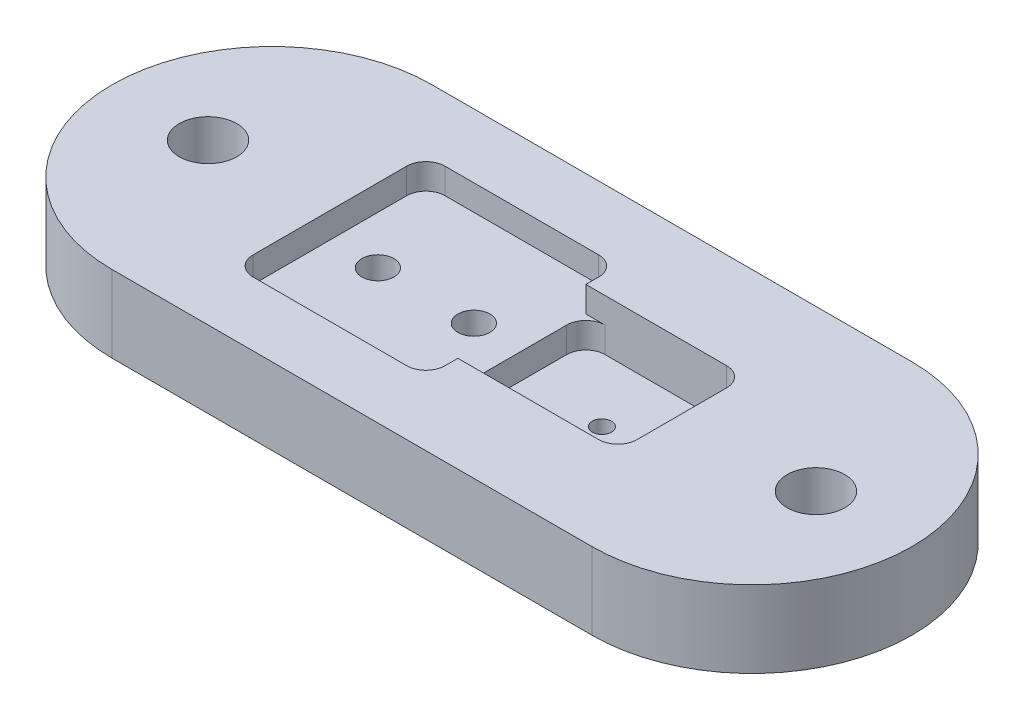
ISO-10303-21;
HEADER;
FILE_DESCRIPTION(('STEP AP214'),'2;1');
FILE_NAME('part.step','',(''),(''),'','','');
FILE_SCHEMA(('AUTOMOTIVE_DESIGN { 1 0 10303 214 1 1 1 1 }'));
ENDSEC;
DATA;
#1=APPLICATION_CONTEXT('core data for automotive mechanical design processes');
#2=APPLICATION_PROTOCOL_DEFINITION('international standard','automotive_design',2000,#1);
#3=PRODUCT_CONTEXT('',#1,'mechanical');
#4=PRODUCT('Part','Part','',(#3));
#5=PRODUCT_RELATED_PRODUCT_CATEGORY('part','',(#4));
#6=PRODUCT_DEFINITION_FORMATION('','',#4);
#7=PRODUCT_DEFINITION_CONTEXT('part definition',#1,'design');
#8=PRODUCT_DEFINITION('design','',#6,#7);
#9=PRODUCT_DEFINITION_SHAPE('','',#8);
#10=(LENGTH_UNIT() NAMED_UNIT(*) SI_UNIT(.MILLI.,.METRE.));
#11=(NAMED_UNIT(*) PLANE_ANGLE_UNIT() SI_UNIT($,.RADIAN.));
#12=(NAMED_UNIT(*) SI_UNIT($,.STERADIAN.) SOLID_ANGLE_UNIT());
#13=UNCERTAINTY_MEASURE_WITH_UNIT(LENGTH_MEASURE(1.E-05),#10,'distance_accuracy_value','');
#14=(GEOMETRIC_REPRESENTATION_CONTEXT(3) GLOBAL_UNCERTAINTY_ASSIGNED_CONTEXT((#13)) GLOBAL_UNIT_ASSIGNED_CONTEXT((#10,
#11,#12)) REPRESENTATION_CONTEXT('',''));
#15=CARTESIAN_POINT('',(0.,0.,0.));
#16=DIRECTION('',(0.,0.,1.));
#17=DIRECTION('',(1.,0.,0.));
#18=AXIS2_PLACEMENT_3D('',#15,#16,#17);
#19=CARTESIAN_POINT('',(39.0414361083652,8.,-40.));
#20=DIRECTION('',(1.,0.,0.));
#21=DIRECTION('',(0.,0.,-1.));
#22=AXIS2_PLACEMENT_3D('',#19,#20,#21);
#23=PLANE('',#22);
#24=DIRECTION('',(0.,0.,-1.));
#25=VECTOR('',#24,1.);
#26=CARTESIAN_POINT('',(39.0414361083652,12.,-40.));
#27=LINE('',#26,#25);
#28=CARTESIAN_POINT('',(39.0414361083652,12.,-35.));
#29=VERTEX_POINT('',#28);
#30=CARTESIAN_POINT('',(39.0414361083652,12.,-37.));
#31=VERTEX_POINT('',#30);
#32=EDGE_CURVE('E196',#29,#31,#27,.T.);
#33=ORIENTED_EDGE('',*,*,#32,.T.);
#34=DIRECTION('',(0.,1.,0.));
#35=VECTOR('',#34,1.);
#36=CARTESIAN_POINT('',(39.0414361083652,8.,-37.));
#37=LINE('',#36,#35);
#38=CARTESIAN_POINT('',(39.0414361083652,8.,-37.));
#39=VERTEX_POINT('',#38);
#40=EDGE_CURVE('E289',#31,#39,#37,.F.);
#41=ORIENTED_EDGE('',*,*,#40,.T.);
#42=DIRECTION('',(0.,0.,-1.));
#43=VECTOR('',#42,1.);
#44=CARTESIAN_POINT('',(39.0414361083652,8.,-40.));
#45=LINE('',#44,#43);
#46=CARTESIAN_POINT('',(39.0414361083652,8.,-35.));
#47=VERTEX_POINT('',#46);
#48=EDGE_CURVE('E198',#47,#39,#45,.T.);
#49=ORIENTED_EDGE('',*,*,#48,.F.);
#50=DIRECTION('',(0.,1.,0.));
#51=VECTOR('',#50,1.);
#52=CARTESIAN_POINT('',(39.0414361083652,4.,-35.));
#53=LINE('',#52,#51);
#54=EDGE_CURVE('E185',#47,#29,#53,.T.);
#55=ORIENTED_EDGE('',*,*,#54,.T.);
#56=EDGE_LOOP('',(#33,#41,#49,#55));
#57=FACE_BOUND('',#56,.T.);
#58=ADVANCED_FACE('F35',(#57),#23,.F.);
#59=CARTESIAN_POINT('',(0.,12.,0.));
#60=DIRECTION('',(0.,0.,-1.));
#61=DIRECTION('',(-1.,0.,0.));
#62=AXIS2_PLACEMENT_3D('',#59,#60,#61);
#63=PLANE('',#62);
#64=DIRECTION('',(1.,0.,0.));
#65=VECTOR('',#64,1.);
#66=CARTESIAN_POINT('',(0.,0.,0.));
#67=LINE('',#66,#65);
#68=CARTESIAN_POINT('',(0.,0.,0.));
#69=VERTEX_POINT('',#68);
#70=CARTESIAN_POINT('',(75.,0.,0.));
#71=VERTEX_POINT('',#70);
#72=EDGE_CURVE('E222',#69,#71,#67,.T.);
#73=ORIENTED_EDGE('',*,*,#72,.T.);
#74=DIRECTION('',(0.,-1.,0.));
#75=VECTOR('',#74,1.);
#76=CARTESIAN_POINT('',(75.,12.,0.));
#77=LINE('',#76,#75);
#78=CARTESIAN_POINT('',(75.,12.,0.));
#79=VERTEX_POINT('',#78);
#80=EDGE_CURVE('E260',#79,#71,#77,.T.);
#81=ORIENTED_EDGE('',*,*,#80,.F.);
#82=DIRECTION('',(1.,0.,0.));
#83=VECTOR('',#82,1.);
#84=CARTESIAN_POINT('',(0.,12.,0.));
#85=LINE('',#84,#83);
#86=CARTESIAN_POINT('',(0.,12.,0.));
#87=VERTEX_POINT('',#86);
#88=EDGE_CURVE('E233',#87,#79,#85,.T.);
#89=ORIENTED_EDGE('',*,*,#88,.F.);
#90=DIRECTION('',(0.,-1.,0.));
#91=VECTOR('',#90,1.);
#92=CARTESIAN_POINT('',(0.,12.,0.));
#93=LINE('',#92,#91);
#94=EDGE_CURVE('E244',#87,#69,#93,.T.);
#95=ORIENTED_EDGE('',*,*,#94,.T.);
#96=EDGE_LOOP('',(#73,#81,#89,#95));
#97=FACE_BOUND('',#96,.T.);
#98=ADVANCED_FACE('F419',(#97),#63,.F.);
#99=CARTESIAN_POINT('',(75.,12.,-25.));
#100=DIRECTION('',(0.,-1.,0.));
#101=DIRECTION('',(0.,0.,-1.));
#102=AXIS2_PLACEMENT_3D('',#99,#100,#101);
#103=CYLINDRICAL_SURFACE('',#102,25.);
#104=CARTESIAN_POINT('',(75.,0.,-25.));
#105=DIRECTION('',(0.,1.,0.));
#106=DIRECTION('',(0.,0.,1.));
#107=AXIS2_PLACEMENT_3D('',#104,#105,#106);
#108=CIRCLE('',#107,25.);
#109=CARTESIAN_POINT('',(75.,0.,-50.));
#110=VERTEX_POINT('',#109);
#111=EDGE_CURVE('E247',#71,#110,#108,.T.);
#112=ORIENTED_EDGE('',*,*,#111,.T.);
#113=DIRECTION('',(0.,-1.,0.));
#114=VECTOR('',#113,1.);
#115=CARTESIAN_POINT('',(75.,12.,-50.));
#116=LINE('',#115,#114);
#117=CARTESIAN_POINT('',(75.,12.,-50.));
#118=VERTEX_POINT('',#117);
#119=EDGE_CURVE('E258',#118,#110,#116,.T.);
#120=ORIENTED_EDGE('',*,*,#119,.F.);
#121=CARTESIAN_POINT('',(75.,12.,-25.));
#122=DIRECTION('',(0.,1.,0.));
#123=DIRECTION('',(0.,0.,1.));
#124=AXIS2_PLACEMENT_3D('',#121,#122,#123);
#125=CIRCLE('',#124,25.);
#126=EDGE_CURVE('E236',#79,#118,#125,.T.);
#127=ORIENTED_EDGE('',*,*,#126,.F.);
#128=ORIENTED_EDGE('',*,*,#80,.T.);
#129=EDGE_LOOP('',(#112,#120,#127,#128));
#130=FACE_BOUND('',#129,.T.);
#131=ADVANCED_FACE('F424',(#130),#103,.T.);
#132=CARTESIAN_POINT('',(0.,12.,-50.));
#133=DIRECTION('',(0.,0.,-1.));
#134=DIRECTION('',(-1.,0.,0.));
#135=AXIS2_PLACEMENT_3D('',#132,#133,#134);
#136=PLANE('',#135);
#137=DIRECTION('',(1.,0.,0.));
#138=VECTOR('',#137,1.);
#139=CARTESIAN_POINT('',(0.,0.,-50.));
#140=LINE('',#139,#138);
#141=CARTESIAN_POINT('',(0.,0.,-50.));
#142=VERTEX_POINT('',#141);
#143=EDGE_CURVE('E250',#142,#110,#140,.T.);
#144=ORIENTED_EDGE('',*,*,#143,.F.);
#145=DIRECTION('',(0.,-1.,0.));
#146=VECTOR('',#145,1.);
#147=CARTESIAN_POINT('',(0.,12.,-50.));
#148=LINE('',#147,#146);
#149=CARTESIAN_POINT('',(0.,12.,-50.));
#150=VERTEX_POINT('',#149);
#151=EDGE_CURVE('E256',#150,#142,#148,.T.);
#152=ORIENTED_EDGE('',*,*,#151,.F.);
#153=DIRECTION('',(1.,0.,0.));
#154=VECTOR('',#153,1.);
#155=CARTESIAN_POINT('',(0.,12.,-50.));
#156=LINE('',#155,#154);
#157=EDGE_CURVE('E239',#150,#118,#156,.T.);
#158=ORIENTED_EDGE('',*,*,#157,.T.);
#159=ORIENTED_EDGE('',*,*,#119,.T.);
#160=EDGE_LOOP('',(#144,#152,#158,#159));
#161=FACE_BOUND('',#160,.T.);
#162=ADVANCED_FACE('F668',(#161),#136,.T.);
#163=CARTESIAN_POINT('',(0.,12.,-25.));
#164=DIRECTION('',(0.,-1.,0.));
#165=DIRECTION('',(0.,0.,-1.));
#166=AXIS2_PLACEMENT_3D('',#163,#164,#165);
#167=CYLINDRICAL_SURFACE('',#166,25.);
#168=CARTESIAN_POINT('',(0.,0.,-25.));
#169=DIRECTION('',(0.,1.,0.));
#170=DIRECTION('',(0.,0.,1.));
#171=AXIS2_PLACEMENT_3D('',#168,#169,#170);
#172=CIRCLE('',#171,25.);
#173=EDGE_CURVE('E237',#142,#69,#172,.T.);
#174=ORIENTED_EDGE('',*,*,#173,.T.);
#175=ORIENTED_EDGE('',*,*,#94,.F.);
#176=CARTESIAN_POINT('',(0.,12.,-25.));
#177=DIRECTION('',(0.,1.,0.));
#178=DIRECTION('',(0.,0.,1.));
#179=AXIS2_PLACEMENT_3D('',#176,#177,#178);
#180=CIRCLE('',#179,25.);
#181=EDGE_CURVE('E242',#150,#87,#180,.T.);
#182=ORIENTED_EDGE('',*,*,#181,.F.);
#183=ORIENTED_EDGE('',*,*,#151,.T.);
#184=EDGE_LOOP('',(#174,#175,#182,#183));
#185=FACE_BOUND('',#184,.T.);
#186=ADVANCED_FACE('F672',(#185),#167,.T.);
#187=CARTESIAN_POINT('',(0.,12.,0.));
#188=DIRECTION('',(0.,1.,0.));
#189=DIRECTION('',(0.,0.,1.));
#190=AXIS2_PLACEMENT_3D('',#187,#188,#189);
#191=PLANE('',#190);
#192=DIRECTION('',(1.,0.,0.));
#193=VECTOR('',#192,1.);
#194=CARTESIAN_POINT('',(39.0414361083652,12.,-15.));
#195=LINE('',#194,#193);
#196=CARTESIAN_POINT('',(39.0414361083652,12.,-15.));
#197=VERTEX_POINT('',#196);
#198=CARTESIAN_POINT('',(61.0414361083652,12.,-15.));
#199=VERTEX_POINT('',#198);
#200=EDGE_CURVE('E339',#197,#199,#195,.T.);
#201=ORIENTED_EDGE('',*,*,#200,.F.);
#202=CARTESIAN_POINT('',(39.0414361083652,12.,-13.));
#203=VERTEX_POINT('',#202);
#204=EDGE_CURVE('E207',#203,#197,#27,.T.);
#205=ORIENTED_EDGE('',*,*,#204,.F.);
#206=CARTESIAN_POINT('',(36.0414361083652,12.,-13.));
#207=DIRECTION('',(0.,1.,0.));
#208=DIRECTION('',(0.,0.,1.));
#209=AXIS2_PLACEMENT_3D('',#206,#207,#208);
#210=CIRCLE('',#209,3.);
#211=CARTESIAN_POINT('',(36.0414361083652,12.,-10.));
#212=VERTEX_POINT('',#211);
#213=EDGE_CURVE('E320',#203,#212,#210,.F.);
#214=ORIENTED_EDGE('',*,*,#213,.T.);
#215=DIRECTION('',(1.,0.,0.));
#216=VECTOR('',#215,1.);
#217=CARTESIAN_POINT('',(9.04143610836523,12.,-10.));
#218=LINE('',#217,#216);
#219=CARTESIAN_POINT('',(12.0414361083652,12.,-10.));
#220=VERTEX_POINT('',#219);
#221=EDGE_CURVE('E208',#220,#212,#218,.T.);
#222=ORIENTED_EDGE('',*,*,#221,.F.);
#223=CARTESIAN_POINT('',(12.0414361083652,12.,-13.));
#224=DIRECTION('',(0.,1.,0.));
#225=DIRECTION('',(0.,0.,1.));
#226=AXIS2_PLACEMENT_3D('',#223,#224,#225);
#227=CIRCLE('',#226,3.);
#228=CARTESIAN_POINT('',(9.04143610836523,12.,-13.));
#229=VERTEX_POINT('',#228);
#230=EDGE_CURVE('E322',#220,#229,#227,.F.);
#231=ORIENTED_EDGE('',*,*,#230,.T.);
#232=DIRECTION('',(0.,0.,1.));
#233=VECTOR('',#232,1.);
#234=CARTESIAN_POINT('',(9.04143610836523,12.,-40.));
#235=LINE('',#234,#233);
#236=CARTESIAN_POINT('',(9.04143610836523,12.,-37.));
#237=VERTEX_POINT('',#236);
#238=EDGE_CURVE('E212',#237,#229,#235,.T.);
#239=ORIENTED_EDGE('',*,*,#238,.F.);
#240=CARTESIAN_POINT('',(12.0414361083652,12.,-37.));
#241=DIRECTION('',(0.,1.,0.));
#242=DIRECTION('',(0.,0.,1.));
#243=AXIS2_PLACEMENT_3D('',#240,#241,#242);
#244=CIRCLE('',#243,3.);
#245=CARTESIAN_POINT('',(12.0414361083652,12.,-40.));
#246=VERTEX_POINT('',#245);
#247=EDGE_CURVE('E324',#237,#246,#244,.F.);
#248=ORIENTED_EDGE('',*,*,#247,.T.);
#249=DIRECTION('',(-1.,0.,0.));
#250=VECTOR('',#249,1.);
#251=CARTESIAN_POINT('',(9.04143610836523,12.,-40.));
#252=LINE('',#251,#250);
#253=CARTESIAN_POINT('',(36.0414361083652,12.,-40.));
#254=VERTEX_POINT('',#253);
#255=EDGE_CURVE('E210',#254,#246,#252,.T.);
#256=ORIENTED_EDGE('',*,*,#255,.F.);
#257=CARTESIAN_POINT('',(36.0414361083652,12.,-37.));
#258=DIRECTION('',(0.,1.,0.));
#259=DIRECTION('',(0.,0.,1.));
#260=AXIS2_PLACEMENT_3D('',#257,#258,#259);
#261=CIRCLE('',#260,3.);
#262=EDGE_CURVE('E206',#254,#31,#261,.F.);
#263=ORIENTED_EDGE('',*,*,#262,.T.);
#264=ORIENTED_EDGE('',*,*,#32,.F.);
#265=DIRECTION('',(1.,0.,0.));
#266=VECTOR('',#265,1.);
#267=CARTESIAN_POINT('',(39.0414361083652,12.,-35.));
#268=LINE('',#267,#266);
#269=CARTESIAN_POINT('',(61.0414361083652,12.,-35.));
#270=VERTEX_POINT('',#269);
#271=EDGE_CURVE('E181',#29,#270,#268,.T.);
#272=ORIENTED_EDGE('',*,*,#271,.T.);
#273=CARTESIAN_POINT('',(61.0414361083652,12.,-32.));
#274=DIRECTION('',(0.,1.,0.));
#275=DIRECTION('',(0.,0.,1.));
#276=AXIS2_PLACEMENT_3D('',#273,#274,#275);
#277=CIRCLE('',#276,3.);
#278=CARTESIAN_POINT('',(64.0414361083652,12.,-32.));
#279=VERTEX_POINT('',#278);
#280=EDGE_CURVE('E43',#270,#279,#277,.F.);
#281=ORIENTED_EDGE('',*,*,#280,.T.);
#282=DIRECTION('',(0.,0.,1.));
#283=VECTOR('',#282,1.);
#284=CARTESIAN_POINT('',(64.0414361083652,12.,-35.));
#285=LINE('',#284,#283);
#286=CARTESIAN_POINT('',(64.0414361083652,12.,-18.));
#287=VERTEX_POINT('',#286);
#288=EDGE_CURVE('E192',#279,#287,#285,.T.);
#289=ORIENTED_EDGE('',*,*,#288,.T.);
#290=CARTESIAN_POINT('',(61.0414361083652,12.,-18.));
#291=DIRECTION('',(0.,1.,0.));
#292=DIRECTION('',(0.,0.,1.));
#293=AXIS2_PLACEMENT_3D('',#290,#291,#292);
#294=CIRCLE('',#293,3.);
#295=EDGE_CURVE('E329',#287,#199,#294,.F.);
#296=ORIENTED_EDGE('',*,*,#295,.T.);
#297=EDGE_LOOP('',(#201,#205,#214,#222,#231,#239,#248,#256,#263,#264,#272,#281,#289,#296));
#298=FACE_BOUND('',#297,.T.);
#299=CARTESIAN_POINT('',(-10.,12.,-25.));
#300=DIRECTION('',(0.,1.,0.));
#301=DIRECTION('',(0.,0.,1.));
#302=AXIS2_PLACEMENT_3D('',#299,#300,#301);
#303=CIRCLE('',#302,4.5);
#304=CARTESIAN_POINT('',(-10.,12.,-20.5));
#305=VERTEX_POINT('',#304);
#306=EDGE_CURVE('E223',#305,#305,#303,.T.);
#307=ORIENTED_EDGE('',*,*,#306,.F.);
#308=EDGE_LOOP('',(#307));
#309=FACE_BOUND('',#308,.T.);
#310=CARTESIAN_POINT('',(85.,12.,-25.));
#311=DIRECTION('',(0.,1.,0.));
#312=DIRECTION('',(0.,0.,-1.));
#313=AXIS2_PLACEMENT_3D('',#310,#311,#312);
#314=CIRCLE('',#313,4.5);
#315=CARTESIAN_POINT('',(85.,12.,-29.5));
#316=VERTEX_POINT('',#315);
#317=EDGE_CURVE('E229',#316,#316,#314,.T.);
#318=ORIENTED_EDGE('',*,*,#317,.F.);
#319=EDGE_LOOP('',(#318));
#320=FACE_BOUND('',#319,.T.);
#321=ORIENTED_EDGE('',*,*,#88,.T.);
#322=ORIENTED_EDGE('',*,*,#126,.T.);
#323=ORIENTED_EDGE('',*,*,#157,.F.);
#324=ORIENTED_EDGE('',*,*,#181,.T.);
#325=EDGE_LOOP('',(#321,#322,#323,#324));
#326=FACE_BOUND('',#325,.T.);
#327=ADVANCED_FACE('F203',(#298,#309,#320,#326),#191,.T.);
#328=CARTESIAN_POINT('',(0.,0.,0.));
#329=DIRECTION('',(0.,1.,0.));
#330=DIRECTION('',(0.,0.,1.));
#331=AXIS2_PLACEMENT_3D('',#328,#329,#330);
#332=PLANE('',#331);
#333=CARTESIAN_POINT('',(16.5414361083652,0.,-25.));
#334=DIRECTION('',(0.,1.,0.));
#335=DIRECTION('',(0.,0.,1.));
#336=AXIS2_PLACEMENT_3D('',#333,#334,#335);
#337=CIRCLE('',#336,2.5);
#338=CARTESIAN_POINT('',(16.5414361083652,0.,-22.5));
#339=VERTEX_POINT('',#338);
#340=EDGE_CURVE('E474',#339,#339,#337,.T.);
#341=ORIENTED_EDGE('',*,*,#340,.T.);
#342=EDGE_LOOP('',(#341));
#343=FACE_BOUND('',#342,.T.);
#344=CARTESIAN_POINT('',(31.5414361083652,0.,-25.));
#345=DIRECTION('',(0.,1.,0.));
#346=DIRECTION('',(0.,0.,1.));
#347=AXIS2_PLACEMENT_3D('',#344,#345,#346);
#348=CIRCLE('',#347,2.5);
#349=CARTESIAN_POINT('',(31.5414361083652,0.,-22.5));
#350=VERTEX_POINT('',#349);
#351=EDGE_CURVE('E478',#350,#350,#348,.T.);
#352=ORIENTED_EDGE('',*,*,#351,.T.);
#353=EDGE_LOOP('',(#352));
#354=FACE_BOUND('',#353,.T.);
#355=CARTESIAN_POINT('',(51.5414361083652,0.,-25.));
#356=DIRECTION('',(0.,1.,0.));
#357=DIRECTION('',(0.,0.,1.));
#358=AXIS2_PLACEMENT_3D('',#355,#356,#357);
#359=CIRCLE('',#358,1.5);
#360=CARTESIAN_POINT('',(51.5414361083652,0.,-23.5));
#361=VERTEX_POINT('',#360);
#362=EDGE_CURVE('E357',#361,#361,#359,.T.);
#363=ORIENTED_EDGE('',*,*,#362,.T.);
#364=EDGE_LOOP('',(#363));
#365=FACE_BOUND('',#364,.T.);
#366=CARTESIAN_POINT('',(-10.,0.,-25.));
#367=DIRECTION('',(0.,1.,0.));
#368=DIRECTION('',(0.,0.,1.));
#369=AXIS2_PLACEMENT_3D('',#366,#367,#368);
#370=CIRCLE('',#369,4.5);
#371=CARTESIAN_POINT('',(-10.,0.,-20.5));
#372=VERTEX_POINT('',#371);
#373=EDGE_CURVE('E219',#372,#372,#370,.T.);
#374=ORIENTED_EDGE('',*,*,#373,.T.);
#375=EDGE_LOOP('',(#374));
#376=FACE_BOUND('',#375,.T.);
#377=CARTESIAN_POINT('',(85.,0.,-25.));
#378=DIRECTION('',(0.,1.,0.));
#379=DIRECTION('',(0.,0.,-1.));
#380=AXIS2_PLACEMENT_3D('',#377,#378,#379);
#381=CIRCLE('',#380,4.5);
#382=CARTESIAN_POINT('',(85.,0.,-29.5));
#383=VERTEX_POINT('',#382);
#384=EDGE_CURVE('E226',#383,#383,#381,.T.);
#385=ORIENTED_EDGE('',*,*,#384,.T.);
#386=EDGE_LOOP('',(#385));
#387=FACE_BOUND('',#386,.T.);
#388=ORIENTED_EDGE('',*,*,#72,.F.);
#389=ORIENTED_EDGE('',*,*,#173,.F.);
#390=ORIENTED_EDGE('',*,*,#143,.T.);
#391=ORIENTED_EDGE('',*,*,#111,.F.);
#392=EDGE_LOOP('',(#388,#389,#390,#391));
#393=FACE_BOUND('',#392,.T.);
#394=ADVANCED_FACE('F543',(#343,#354,#365,#376,#387,#393),#332,.F.);
#395=CARTESIAN_POINT('',(85.,0.,-25.));
#396=DIRECTION('',(0.,1.,0.));
#397=DIRECTION('',(0.,0.,1.));
#398=AXIS2_PLACEMENT_3D('',#395,#396,#397);
#399=CYLINDRICAL_SURFACE('',#398,4.5);
#400=ORIENTED_EDGE('',*,*,#384,.F.);
#401=EDGE_LOOP('',(#400));
#402=FACE_BOUND('',#401,.T.);
#403=ORIENTED_EDGE('',*,*,#317,.T.);
#404=EDGE_LOOP('',(#403));
#405=FACE_BOUND('',#404,.T.);
#406=ADVANCED_FACE('F547',(#402,#405),#399,.F.);
#407=CARTESIAN_POINT('',(-10.,0.,-25.));
#408=DIRECTION('',(0.,1.,0.));
#409=DIRECTION('',(0.,0.,1.));
#410=AXIS2_PLACEMENT_3D('',#407,#408,#409);
#411=CYLINDRICAL_SURFACE('',#410,4.5);
#412=ORIENTED_EDGE('',*,*,#373,.F.);
#413=EDGE_LOOP('',(#412));
#414=FACE_BOUND('',#413,.T.);
#415=ORIENTED_EDGE('',*,*,#306,.T.);
#416=EDGE_LOOP('',(#415));
#417=FACE_BOUND('',#416,.T.);
#418=ADVANCED_FACE('F437',(#414,#417),#411,.F.);
#419=CARTESIAN_POINT('',(9.04143610836523,8.,-40.));
#420=DIRECTION('',(-1.,0.,0.));
#421=DIRECTION('',(0.,0.,1.));
#422=AXIS2_PLACEMENT_3D('',#419,#420,#421);
#423=PLANE('',#422);
#424=ORIENTED_EDGE('',*,*,#238,.T.);
#425=DIRECTION('',(0.,1.,0.));
#426=VECTOR('',#425,1.);
#427=CARTESIAN_POINT('',(9.04143610836523,8.,-13.));
#428=LINE('',#427,#426);
#429=CARTESIAN_POINT('',(9.04143610836523,8.,-13.));
#430=VERTEX_POINT('',#429);
#431=EDGE_CURVE('E282',#229,#430,#428,.F.);
#432=ORIENTED_EDGE('',*,*,#431,.T.);
#433=DIRECTION('',(0.,0.,1.));
#434=VECTOR('',#433,1.);
#435=CARTESIAN_POINT('',(9.04143610836523,8.,-40.));
#436=LINE('',#435,#434);
#437=CARTESIAN_POINT('',(9.04143610836523,8.,-37.));
#438=VERTEX_POINT('',#437);
#439=EDGE_CURVE('E218',#438,#430,#436,.T.);
#440=ORIENTED_EDGE('',*,*,#439,.F.);
#441=DIRECTION('',(0.,1.,0.));
#442=VECTOR('',#441,1.);
#443=CARTESIAN_POINT('',(9.04143610836523,12.,-37.));
#444=LINE('',#443,#442);
#445=EDGE_CURVE('E279',#438,#237,#444,.T.);
#446=ORIENTED_EDGE('',*,*,#445,.T.);
#447=EDGE_LOOP('',(#424,#432,#440,#446));
#448=FACE_BOUND('',#447,.T.);
#449=ADVANCED_FACE('F374',(#448),#423,.F.);
#450=CARTESIAN_POINT('',(9.04143610836523,8.,-40.));
#451=DIRECTION('',(0.,0.,-1.));
#452=DIRECTION('',(-1.,0.,0.));
#453=AXIS2_PLACEMENT_3D('',#450,#451,#452);
#454=PLANE('',#453);
#455=ORIENTED_EDGE('',*,*,#255,.T.);
#456=DIRECTION('',(0.,1.,0.));
#457=VECTOR('',#456,1.);
#458=CARTESIAN_POINT('',(12.0414361083652,8.,-40.));
#459=LINE('',#458,#457);
#460=CARTESIAN_POINT('',(12.0414361083652,8.,-40.));
#461=VERTEX_POINT('',#460);
#462=EDGE_CURVE('E287',#246,#461,#459,.F.);
#463=ORIENTED_EDGE('',*,*,#462,.T.);
#464=DIRECTION('',(-1.,0.,0.));
#465=VECTOR('',#464,1.);
#466=CARTESIAN_POINT('',(9.04143610836523,8.,-40.));
#467=LINE('',#466,#465);
#468=CARTESIAN_POINT('',(36.0414361083652,8.,-40.));
#469=VERTEX_POINT('',#468);
#470=EDGE_CURVE('E232',#469,#461,#467,.T.);
#471=ORIENTED_EDGE('',*,*,#470,.F.);
#472=DIRECTION('',(0.,1.,0.));
#473=VECTOR('',#472,1.);
#474=CARTESIAN_POINT('',(36.0414361083652,12.,-40.));
#475=LINE('',#474,#473);
#476=EDGE_CURVE('E284',#469,#254,#475,.T.);
#477=ORIENTED_EDGE('',*,*,#476,.T.);
#478=EDGE_LOOP('',(#455,#463,#471,#477));
#479=FACE_BOUND('',#478,.T.);
#480=ADVANCED_FACE('F404',(#479),#454,.F.);
#481=CARTESIAN_POINT('',(39.0414361083652,8.,-13.));
#482=VERTEX_POINT('',#481);
#483=CARTESIAN_POINT('',(39.0414361083652,8.,-15.));
#484=VERTEX_POINT('',#483);
#485=EDGE_CURVE('E368',#482,#484,#45,.T.);
#486=ORIENTED_EDGE('',*,*,#485,.F.);
#487=DIRECTION('',(0.,1.,0.));
#488=VECTOR('',#487,1.);
#489=CARTESIAN_POINT('',(39.0414361083652,12.,-13.));
#490=LINE('',#489,#488);
#491=EDGE_CURVE('E263',#482,#203,#490,.T.);
#492=ORIENTED_EDGE('',*,*,#491,.T.);
#493=ORIENTED_EDGE('',*,*,#204,.T.);
#494=DIRECTION('',(0.,1.,0.));
#495=VECTOR('',#494,1.);
#496=CARTESIAN_POINT('',(39.0414361083652,4.,-15.));
#497=LINE('',#496,#495);
#498=EDGE_CURVE('E199',#484,#197,#497,.T.);
#499=ORIENTED_EDGE('',*,*,#498,.F.);
#500=EDGE_LOOP('',(#486,#492,#493,#499));
#501=FACE_BOUND('',#500,.T.);
#502=ADVANCED_FACE('F396',(#501),#23,.F.);
#503=CARTESIAN_POINT('',(9.04143610836523,8.,-10.));
#504=DIRECTION('',(0.,0.,1.));
#505=DIRECTION('',(1.,0.,0.));
#506=AXIS2_PLACEMENT_3D('',#503,#504,#505);
#507=PLANE('',#506);
#508=ORIENTED_EDGE('',*,*,#221,.T.);
#509=DIRECTION('',(0.,1.,0.));
#510=VECTOR('',#509,1.);
#511=CARTESIAN_POINT('',(36.0414361083652,8.,-10.));
#512=LINE('',#511,#510);
#513=CARTESIAN_POINT('',(36.0414361083652,8.,-10.));
#514=VERTEX_POINT('',#513);
#515=EDGE_CURVE('E269',#212,#514,#512,.F.);
#516=ORIENTED_EDGE('',*,*,#515,.T.);
#517=DIRECTION('',(1.,0.,0.));
#518=VECTOR('',#517,1.);
#519=CARTESIAN_POINT('',(9.04143610836523,8.,-10.));
#520=LINE('',#519,#518);
#521=CARTESIAN_POINT('',(12.0414361083652,8.,-10.));
#522=VERTEX_POINT('',#521);
#523=EDGE_CURVE('E363',#522,#514,#520,.T.);
#524=ORIENTED_EDGE('',*,*,#523,.F.);
#525=DIRECTION('',(0.,1.,0.));
#526=VECTOR('',#525,1.);
#527=CARTESIAN_POINT('',(12.0414361083652,12.,-10.));
#528=LINE('',#527,#526);
#529=EDGE_CURVE('E266',#522,#220,#528,.T.);
#530=ORIENTED_EDGE('',*,*,#529,.T.);
#531=EDGE_LOOP('',(#508,#516,#524,#530));
#532=FACE_BOUND('',#531,.T.);
#533=ADVANCED_FACE('F385',(#532),#507,.F.);
#534=CARTESIAN_POINT('',(0.,8.,0.));
#535=DIRECTION('',(0.,1.,0.));
#536=DIRECTION('',(0.,0.,1.));
#537=AXIS2_PLACEMENT_3D('',#534,#535,#536);
#538=PLANE('',#537);
#539=CARTESIAN_POINT('',(16.5414361083652,8.,-25.));
#540=DIRECTION('',(0.,1.,0.));
#541=DIRECTION('',(0.,0.,1.));
#542=AXIS2_PLACEMENT_3D('',#539,#540,#541);
#543=CIRCLE('',#542,2.5);
#544=CARTESIAN_POINT('',(16.5414361083652,8.,-22.5));
#545=VERTEX_POINT('',#544);
#546=EDGE_CURVE('E477',#545,#545,#543,.T.);
#547=ORIENTED_EDGE('',*,*,#546,.F.);
#548=EDGE_LOOP('',(#547));
#549=FACE_BOUND('',#548,.T.);
#550=CARTESIAN_POINT('',(31.5414361083652,8.,-25.));
#551=DIRECTION('',(0.,1.,0.));
#552=DIRECTION('',(0.,0.,1.));
#553=AXIS2_PLACEMENT_3D('',#550,#551,#552);
#554=CIRCLE('',#553,2.5);
#555=CARTESIAN_POINT('',(31.5414361083652,8.,-22.5));
#556=VERTEX_POINT('',#555);
#557=EDGE_CURVE('E483',#556,#556,#554,.T.);
#558=ORIENTED_EDGE('',*,*,#557,.F.);
#559=EDGE_LOOP('',(#558));
#560=FACE_BOUND('',#559,.T.);
#561=ORIENTED_EDGE('',*,*,#523,.T.);
#562=CARTESIAN_POINT('',(36.0414361083652,8.,-13.));
#563=DIRECTION('',(0.,1.,0.));
#564=DIRECTION('',(0.,0.,1.));
#565=AXIS2_PLACEMENT_3D('',#562,#563,#564);
#566=CIRCLE('',#565,3.);
#567=EDGE_CURVE('E277',#514,#482,#566,.T.);
#568=ORIENTED_EDGE('',*,*,#567,.T.);
#569=ORIENTED_EDGE('',*,*,#485,.T.);
#570=DIRECTION('',(-1.,0.,0.));
#571=VECTOR('',#570,1.);
#572=CARTESIAN_POINT('',(39.0414361083652,8.,-15.));
#573=LINE('',#572,#571);
#574=CARTESIAN_POINT('',(42.0414361083652,8.,-15.));
#575=VERTEX_POINT('',#574);
#576=EDGE_CURVE('E293',#575,#484,#573,.T.);
#577=ORIENTED_EDGE('',*,*,#576,.F.);
#578=CARTESIAN_POINT('',(42.0414361083652,8.,-18.));
#579=DIRECTION('',(0.,1.,0.));
#580=DIRECTION('',(0.,0.,1.));
#581=AXIS2_PLACEMENT_3D('',#578,#579,#580);
#582=CIRCLE('',#581,3.);
#583=CARTESIAN_POINT('',(39.0414361083652,8.,-18.));
#584=VERTEX_POINT('',#583);
#585=EDGE_CURVE('E327',#575,#584,#582,.F.);
#586=ORIENTED_EDGE('',*,*,#585,.T.);
#587=CARTESIAN_POINT('',(39.0414361083652,8.,-32.));
#588=VERTEX_POINT('',#587);
#589=EDGE_CURVE('E366',#584,#588,#45,.T.);
#590=ORIENTED_EDGE('',*,*,#589,.T.);
#591=CARTESIAN_POINT('',(42.0414361083652,8.,-32.));
#592=DIRECTION('',(0.,1.,0.));
#593=DIRECTION('',(0.,0.,1.));
#594=AXIS2_PLACEMENT_3D('',#591,#592,#593);
#595=CIRCLE('',#594,3.);
#596=CARTESIAN_POINT('',(42.0414361083652,8.,-35.));
#597=VERTEX_POINT('',#596);
#598=EDGE_CURVE('E11',#588,#597,#595,.F.);
#599=ORIENTED_EDGE('',*,*,#598,.T.);
#600=DIRECTION('',(1.,0.,0.));
#601=VECTOR('',#600,1.);
#602=CARTESIAN_POINT('',(0.,8.,-35.));
#603=LINE('',#602,#601);
#604=EDGE_CURVE('E49',#47,#597,#603,.T.);
#605=ORIENTED_EDGE('',*,*,#604,.F.);
#606=ORIENTED_EDGE('',*,*,#48,.T.);
#607=CARTESIAN_POINT('',(36.0414361083652,8.,-37.));
#608=DIRECTION('',(0.,1.,0.));
#609=DIRECTION('',(0.,0.,1.));
#610=AXIS2_PLACEMENT_3D('',#607,#608,#609);
#611=CIRCLE('',#610,3.);
#612=EDGE_CURVE('E271',#39,#469,#611,.T.);
#613=ORIENTED_EDGE('',*,*,#612,.T.);
#614=ORIENTED_EDGE('',*,*,#470,.T.);
#615=CARTESIAN_POINT('',(12.0414361083652,8.,-37.));
#616=DIRECTION('',(0.,1.,0.));
#617=DIRECTION('',(0.,0.,1.));
#618=AXIS2_PLACEMENT_3D('',#615,#616,#617);
#619=CIRCLE('',#618,3.);
#620=EDGE_CURVE('E273',#461,#438,#619,.T.);
#621=ORIENTED_EDGE('',*,*,#620,.T.);
#622=ORIENTED_EDGE('',*,*,#439,.T.);
#623=CARTESIAN_POINT('',(12.0414361083652,8.,-13.));
#624=DIRECTION('',(0.,1.,0.));
#625=DIRECTION('',(0.,0.,1.));
#626=AXIS2_PLACEMENT_3D('',#623,#624,#625);
#627=CIRCLE('',#626,3.);
#628=EDGE_CURVE('E275',#430,#522,#627,.T.);
#629=ORIENTED_EDGE('',*,*,#628,.T.);
#630=EDGE_LOOP('',(#561,#568,#569,#577,#586,#590,#599,#605,#606,#613,#614,#621,#622,#629));
#631=FACE_BOUND('',#630,.T.);
#632=ADVANCED_FACE('F382',(#549,#560,#631),#538,.T.);
#633=CARTESIAN_POINT('',(39.0414361083652,4.,-15.));
#634=DIRECTION('',(0.,0.,1.));
#635=DIRECTION('',(1.,0.,0.));
#636=AXIS2_PLACEMENT_3D('',#633,#634,#635);
#637=PLANE('',#636);
#638=DIRECTION('',(1.,0.,0.));
#639=VECTOR('',#638,1.);
#640=CARTESIAN_POINT('',(39.0414361083652,4.,-15.));
#641=LINE('',#640,#639);
#642=CARTESIAN_POINT('',(42.0414361083652,4.,-15.));
#643=VERTEX_POINT('',#642);
#644=CARTESIAN_POINT('',(61.0414361083652,4.,-15.));
#645=VERTEX_POINT('',#644);
#646=EDGE_CURVE('E191',#643,#645,#641,.T.);
#647=ORIENTED_EDGE('',*,*,#646,.F.);
#648=DIRECTION('',(0.,1.,0.));
#649=VECTOR('',#648,1.);
#650=CARTESIAN_POINT('',(42.0414361083652,8.,-15.));
#651=LINE('',#650,#649);
#652=EDGE_CURVE('E295',#643,#575,#651,.T.);
#653=ORIENTED_EDGE('',*,*,#652,.T.);
#654=ORIENTED_EDGE('',*,*,#576,.T.);
#655=ORIENTED_EDGE('',*,*,#498,.T.);
#656=ORIENTED_EDGE('',*,*,#200,.T.);
#657=DIRECTION('',(0.,1.,0.));
#658=VECTOR('',#657,1.);
#659=CARTESIAN_POINT('',(61.0414361083652,4.,-15.));
#660=LINE('',#659,#658);
#661=EDGE_CURVE('E291',#199,#645,#660,.F.);
#662=ORIENTED_EDGE('',*,*,#661,.T.);
#663=EDGE_LOOP('',(#647,#653,#654,#655,#656,#662));
#664=FACE_BOUND('',#663,.T.);
#665=ADVANCED_FACE('F442',(#664),#637,.F.);
#666=CARTESIAN_POINT('',(39.0414361083652,4.,-35.));
#667=DIRECTION('',(-1.,0.,0.));
#668=DIRECTION('',(0.,0.,1.));
#669=AXIS2_PLACEMENT_3D('',#666,#667,#668);
#670=PLANE('',#669);
#671=ORIENTED_EDGE('',*,*,#589,.F.);
#672=DIRECTION('',(0.,1.,0.));
#673=VECTOR('',#672,1.);
#674=CARTESIAN_POINT('',(39.0414361083652,4.,-18.));
#675=LINE('',#674,#673);
#676=CARTESIAN_POINT('',(39.0414361083652,4.,-18.));
#677=VERTEX_POINT('',#676);
#678=EDGE_CURVE('E301',#584,#677,#675,.F.);
#679=ORIENTED_EDGE('',*,*,#678,.T.);
#680=DIRECTION('',(0.,0.,1.));
#681=VECTOR('',#680,1.);
#682=CARTESIAN_POINT('',(39.0414361083652,4.,-35.));
#683=LINE('',#682,#681);
#684=CARTESIAN_POINT('',(39.0414361083652,4.,-32.));
#685=VERTEX_POINT('',#684);
#686=EDGE_CURVE('E200',#685,#677,#683,.T.);
#687=ORIENTED_EDGE('',*,*,#686,.F.);
#688=DIRECTION('',(0.,1.,0.));
#689=VECTOR('',#688,1.);
#690=CARTESIAN_POINT('',(39.0414361083652,4.,-32.));
#691=LINE('',#690,#689);
#692=EDGE_CURVE('E298',#685,#588,#691,.T.);
#693=ORIENTED_EDGE('',*,*,#692,.T.);
#694=EDGE_LOOP('',(#671,#679,#687,#693));
#695=FACE_BOUND('',#694,.T.);
#696=ADVANCED_FACE('F446',(#695),#670,.F.);
#697=CARTESIAN_POINT('',(39.0414361083652,4.,-35.));
#698=DIRECTION('',(0.,0.,1.));
#699=DIRECTION('',(1.,0.,0.));
#700=AXIS2_PLACEMENT_3D('',#697,#698,#699);
#701=PLANE('',#700);
#702=DIRECTION('',(1.,0.,0.));
#703=VECTOR('',#702,1.);
#704=CARTESIAN_POINT('',(39.0414361083652,4.,-35.));
#705=LINE('',#704,#703);
#706=CARTESIAN_POINT('',(42.0414361083652,4.,-35.));
#707=VERTEX_POINT('',#706);
#708=CARTESIAN_POINT('',(61.0414361083652,4.,-35.));
#709=VERTEX_POINT('',#708);
#710=EDGE_CURVE('E347',#707,#709,#705,.T.);
#711=ORIENTED_EDGE('',*,*,#710,.T.);
#712=DIRECTION('',(0.,1.,0.));
#713=VECTOR('',#712,1.);
#714=CARTESIAN_POINT('',(61.0414361083652,12.,-35.));
#715=LINE('',#714,#713);
#716=EDGE_CURVE('E188',#709,#270,#715,.T.);
#717=ORIENTED_EDGE('',*,*,#716,.T.);
#718=ORIENTED_EDGE('',*,*,#271,.F.);
#719=ORIENTED_EDGE('',*,*,#54,.F.);
#720=ORIENTED_EDGE('',*,*,#604,.T.);
#721=DIRECTION('',(0.,1.,0.));
#722=VECTOR('',#721,1.);
#723=CARTESIAN_POINT('',(42.0414361083652,4.,-35.));
#724=LINE('',#723,#722);
#725=EDGE_CURVE('E316',#597,#707,#724,.F.);
#726=ORIENTED_EDGE('',*,*,#725,.T.);
#727=EDGE_LOOP('',(#711,#717,#718,#719,#720,#726));
#728=FACE_BOUND('',#727,.T.);
#729=ADVANCED_FACE('F184',(#728),#701,.T.);
#730=CARTESIAN_POINT('',(64.0414361083652,4.,-35.));
#731=DIRECTION('',(-1.,0.,0.));
#732=DIRECTION('',(0.,0.,1.));
#733=AXIS2_PLACEMENT_3D('',#730,#731,#732);
#734=PLANE('',#733);
#735=DIRECTION('',(0.,0.,1.));
#736=VECTOR('',#735,1.);
#737=CARTESIAN_POINT('',(64.0414361083652,4.,-35.));
#738=LINE('',#737,#736);
#739=CARTESIAN_POINT('',(64.0414361083652,4.,-32.));
#740=VERTEX_POINT('',#739);
#741=CARTESIAN_POINT('',(64.0414361083652,4.,-18.));
#742=VERTEX_POINT('',#741);
#743=EDGE_CURVE('E349',#740,#742,#738,.T.);
#744=ORIENTED_EDGE('',*,*,#743,.T.);
#745=DIRECTION('',(0.,1.,0.));
#746=VECTOR('',#745,1.);
#747=CARTESIAN_POINT('',(64.0414361083652,4.,-18.));
#748=LINE('',#747,#746);
#749=EDGE_CURVE('E313',#742,#287,#748,.T.);
#750=ORIENTED_EDGE('',*,*,#749,.T.);
#751=ORIENTED_EDGE('',*,*,#288,.F.);
#752=DIRECTION('',(0.,1.,0.));
#753=VECTOR('',#752,1.);
#754=CARTESIAN_POINT('',(64.0414361083652,4.,-32.));
#755=LINE('',#754,#753);
#756=EDGE_CURVE('E311',#279,#740,#755,.F.);
#757=ORIENTED_EDGE('',*,*,#756,.T.);
#758=EDGE_LOOP('',(#744,#750,#751,#757));
#759=FACE_BOUND('',#758,.T.);
#760=ADVANCED_FACE('F336',(#759),#734,.T.);
#761=CARTESIAN_POINT('',(0.,4.,0.));
#762=DIRECTION('',(0.,-1.,0.));
#763=DIRECTION('',(0.,0.,-1.));
#764=AXIS2_PLACEMENT_3D('',#761,#762,#763);
#765=PLANE('',#764);
#766=CARTESIAN_POINT('',(51.5414361083652,4.,-25.));
#767=DIRECTION('',(0.,1.,0.));
#768=DIRECTION('',(0.,0.,1.));
#769=AXIS2_PLACEMENT_3D('',#766,#767,#768);
#770=CIRCLE('',#769,1.5);
#771=CARTESIAN_POINT('',(51.5414361083652,4.,-23.5));
#772=VERTEX_POINT('',#771);
#773=EDGE_CURVE('E480',#772,#772,#770,.T.);
#774=ORIENTED_EDGE('',*,*,#773,.F.);
#775=EDGE_LOOP('',(#774));
#776=FACE_BOUND('',#775,.T.);
#777=ORIENTED_EDGE('',*,*,#686,.T.);
#778=CARTESIAN_POINT('',(42.0414361083652,4.,-18.));
#779=DIRECTION('',(0.,-1.,0.));
#780=DIRECTION('',(0.,0.,-1.));
#781=AXIS2_PLACEMENT_3D('',#778,#779,#780);
#782=CIRCLE('',#781,3.);
#783=EDGE_CURVE('E309',#677,#643,#782,.F.);
#784=ORIENTED_EDGE('',*,*,#783,.T.);
#785=ORIENTED_EDGE('',*,*,#646,.T.);
#786=CARTESIAN_POINT('',(61.0414361083652,4.,-18.));
#787=DIRECTION('',(0.,-1.,0.));
#788=DIRECTION('',(0.,0.,-1.));
#789=AXIS2_PLACEMENT_3D('',#786,#787,#788);
#790=CIRCLE('',#789,3.);
#791=EDGE_CURVE('E307',#645,#742,#790,.F.);
#792=ORIENTED_EDGE('',*,*,#791,.T.);
#793=ORIENTED_EDGE('',*,*,#743,.F.);
#794=CARTESIAN_POINT('',(61.0414361083652,4.,-32.));
#795=DIRECTION('',(0.,-1.,0.));
#796=DIRECTION('',(0.,0.,-1.));
#797=AXIS2_PLACEMENT_3D('',#794,#795,#796);
#798=CIRCLE('',#797,3.);
#799=EDGE_CURVE('E305',#740,#709,#798,.F.);
#800=ORIENTED_EDGE('',*,*,#799,.T.);
#801=ORIENTED_EDGE('',*,*,#710,.F.);
#802=CARTESIAN_POINT('',(42.0414361083652,4.,-32.));
#803=DIRECTION('',(0.,-1.,0.));
#804=DIRECTION('',(0.,0.,-1.));
#805=AXIS2_PLACEMENT_3D('',#802,#803,#804);
#806=CIRCLE('',#805,3.);
#807=EDGE_CURVE('E303',#707,#685,#806,.F.);
#808=ORIENTED_EDGE('',*,*,#807,.T.);
#809=EDGE_LOOP('',(#777,#784,#785,#792,#793,#800,#801,#808));
#810=FACE_BOUND('',#809,.T.);
#811=ADVANCED_FACE('F346',(#776,#810),#765,.F.);
#812=CARTESIAN_POINT('',(36.0414361083652,8.,-13.));
#813=DIRECTION('',(0.,-1.,0.));
#814=DIRECTION('',(0.,0.,-1.));
#815=AXIS2_PLACEMENT_3D('',#812,#813,#814);
#816=CYLINDRICAL_SURFACE('',#815,3.);
#817=ORIENTED_EDGE('',*,*,#567,.F.);
#818=ORIENTED_EDGE('',*,*,#515,.F.);
#819=ORIENTED_EDGE('',*,*,#213,.F.);
#820=ORIENTED_EDGE('',*,*,#491,.F.);
#821=EDGE_LOOP('',(#817,#818,#819,#820));
#822=FACE_BOUND('',#821,.T.);
#823=ADVANCED_FACE('F389',(#822),#816,.F.);
#824=CARTESIAN_POINT('',(12.0414361083652,8.,-13.));
#825=DIRECTION('',(0.,-1.,0.));
#826=DIRECTION('',(0.,0.,-1.));
#827=AXIS2_PLACEMENT_3D('',#824,#825,#826);
#828=CYLINDRICAL_SURFACE('',#827,3.);
#829=ORIENTED_EDGE('',*,*,#628,.F.);
#830=ORIENTED_EDGE('',*,*,#431,.F.);
#831=ORIENTED_EDGE('',*,*,#230,.F.);
#832=ORIENTED_EDGE('',*,*,#529,.F.);
#833=EDGE_LOOP('',(#829,#830,#831,#832));
#834=FACE_BOUND('',#833,.T.);
#835=ADVANCED_FACE('F379',(#834),#828,.F.);
#836=CARTESIAN_POINT('',(12.0414361083652,8.,-37.));
#837=DIRECTION('',(0.,-1.,0.));
#838=DIRECTION('',(0.,0.,-1.));
#839=AXIS2_PLACEMENT_3D('',#836,#837,#838);
#840=CYLINDRICAL_SURFACE('',#839,3.);
#841=ORIENTED_EDGE('',*,*,#620,.F.);
#842=ORIENTED_EDGE('',*,*,#462,.F.);
#843=ORIENTED_EDGE('',*,*,#247,.F.);
#844=ORIENTED_EDGE('',*,*,#445,.F.);
#845=EDGE_LOOP('',(#841,#842,#843,#844));
#846=FACE_BOUND('',#845,.T.);
#847=ADVANCED_FACE('F408',(#846),#840,.F.);
#848=CARTESIAN_POINT('',(36.0414361083652,8.,-37.));
#849=DIRECTION('',(0.,-1.,0.));
#850=DIRECTION('',(0.,0.,-1.));
#851=AXIS2_PLACEMENT_3D('',#848,#849,#850);
#852=CYLINDRICAL_SURFACE('',#851,3.);
#853=ORIENTED_EDGE('',*,*,#612,.F.);
#854=ORIENTED_EDGE('',*,*,#40,.F.);
#855=ORIENTED_EDGE('',*,*,#262,.F.);
#856=ORIENTED_EDGE('',*,*,#476,.F.);
#857=EDGE_LOOP('',(#853,#854,#855,#856));
#858=FACE_BOUND('',#857,.T.);
#859=ADVANCED_FACE('F402',(#858),#852,.F.);
#860=CARTESIAN_POINT('',(42.0414361083652,4.,-18.));
#861=DIRECTION('',(0.,-1.,0.));
#862=DIRECTION('',(0.,0.,-1.));
#863=AXIS2_PLACEMENT_3D('',#860,#861,#862);
#864=CYLINDRICAL_SURFACE('',#863,3.);
#865=ORIENTED_EDGE('',*,*,#783,.F.);
#866=ORIENTED_EDGE('',*,*,#678,.F.);
#867=ORIENTED_EDGE('',*,*,#585,.F.);
#868=ORIENTED_EDGE('',*,*,#652,.F.);
#869=EDGE_LOOP('',(#865,#866,#867,#868));
#870=FACE_BOUND('',#869,.T.);
#871=ADVANCED_FACE('F415',(#870),#864,.F.);
#872=CARTESIAN_POINT('',(61.0414361083652,4.,-18.));
#873=DIRECTION('',(0.,1.,0.));
#874=DIRECTION('',(0.,0.,1.));
#875=AXIS2_PLACEMENT_3D('',#872,#873,#874);
#876=CYLINDRICAL_SURFACE('',#875,3.);
#877=ORIENTED_EDGE('',*,*,#791,.F.);
#878=ORIENTED_EDGE('',*,*,#661,.F.);
#879=ORIENTED_EDGE('',*,*,#295,.F.);
#880=ORIENTED_EDGE('',*,*,#749,.F.);
#881=EDGE_LOOP('',(#877,#878,#879,#880));
#882=FACE_BOUND('',#881,.T.);
#883=ADVANCED_FACE('F498',(#882),#876,.F.);
#884=CARTESIAN_POINT('',(61.0414361083652,4.,-32.));
#885=DIRECTION('',(0.,-1.,0.));
#886=DIRECTION('',(0.,0.,-1.));
#887=AXIS2_PLACEMENT_3D('',#884,#885,#886);
#888=CYLINDRICAL_SURFACE('',#887,3.);
#889=ORIENTED_EDGE('',*,*,#799,.F.);
#890=ORIENTED_EDGE('',*,*,#756,.F.);
#891=ORIENTED_EDGE('',*,*,#280,.F.);
#892=ORIENTED_EDGE('',*,*,#716,.F.);
#893=EDGE_LOOP('',(#889,#890,#891,#892));
#894=FACE_BOUND('',#893,.T.);
#895=ADVANCED_FACE('F342',(#894),#888,.F.);
#896=CARTESIAN_POINT('',(42.0414361083652,4.,-32.));
#897=DIRECTION('',(0.,1.,0.));
#898=DIRECTION('',(0.,0.,1.));
#899=AXIS2_PLACEMENT_3D('',#896,#897,#898);
#900=CYLINDRICAL_SURFACE('',#899,3.);
#901=ORIENTED_EDGE('',*,*,#807,.F.);
#902=ORIENTED_EDGE('',*,*,#725,.F.);
#903=ORIENTED_EDGE('',*,*,#598,.F.);
#904=ORIENTED_EDGE('',*,*,#692,.F.);
#905=EDGE_LOOP('',(#901,#902,#903,#904));
#906=FACE_BOUND('',#905,.T.);
#907=ADVANCED_FACE('F37',(#906),#900,.F.);
#908=CARTESIAN_POINT('',(51.5414361083652,0.,-25.));
#909=DIRECTION('',(0.,1.,0.));
#910=DIRECTION('',(0.,0.,1.));
#911=AXIS2_PLACEMENT_3D('',#908,#909,#910);
#912=CYLINDRICAL_SURFACE('',#911,1.5);
#913=ORIENTED_EDGE('',*,*,#362,.F.);
#914=EDGE_LOOP('',(#913));
#915=FACE_BOUND('',#914,.T.);
#916=ORIENTED_EDGE('',*,*,#773,.T.);
#917=EDGE_LOOP('',(#916));
#918=FACE_BOUND('',#917,.T.);
#919=ADVANCED_FACE('F458',(#915,#918),#912,.F.);
#920=CARTESIAN_POINT('',(31.5414361083652,0.,-25.));
#921=DIRECTION('',(0.,1.,0.));
#922=DIRECTION('',(0.,0.,1.));
#923=AXIS2_PLACEMENT_3D('',#920,#921,#922);
#924=CYLINDRICAL_SURFACE('',#923,2.5);
#925=ORIENTED_EDGE('',*,*,#351,.F.);
#926=EDGE_LOOP('',(#925));
#927=FACE_BOUND('',#926,.T.);
#928=ORIENTED_EDGE('',*,*,#557,.T.);
#929=EDGE_LOOP('',(#928));
#930=FACE_BOUND('',#929,.T.);
#931=ADVANCED_FACE('F461',(#927,#930),#924,.F.);
#932=CARTESIAN_POINT('',(16.5414361083652,0.,-25.));
#933=DIRECTION('',(0.,1.,0.));
#934=DIRECTION('',(0.,0.,1.));
#935=AXIS2_PLACEMENT_3D('',#932,#933,#934);
#936=CYLINDRICAL_SURFACE('',#935,2.5);
#937=ORIENTED_EDGE('',*,*,#340,.F.);
#938=EDGE_LOOP('',(#937));
#939=FACE_BOUND('',#938,.T.);
#940=ORIENTED_EDGE('',*,*,#546,.T.);
#941=EDGE_LOOP('',(#940));
#942=FACE_BOUND('',#941,.T.);
#943=ADVANCED_FACE('F465',(#939,#942),#936,.F.);
#944=CLOSED_SHELL('',(#58,#98,#131,#162,#186,#327,#394,#406,#418,#449,#480,#502,#533,#632,#665,
#696,#729,#760,#811,#823,#835,#847,#859,#871,#883,#895,#907,#919,#931,#943));
#945=MANIFOLD_SOLID_BREP('B2',#944);
#946=ADVANCED_BREP_SHAPE_REPRESENTATION('',(#18,#945),#14);
#947=SHAPE_DEFINITION_REPRESENTATION(#9,#946);
ENDSEC;
END-ISO-10303-21;
